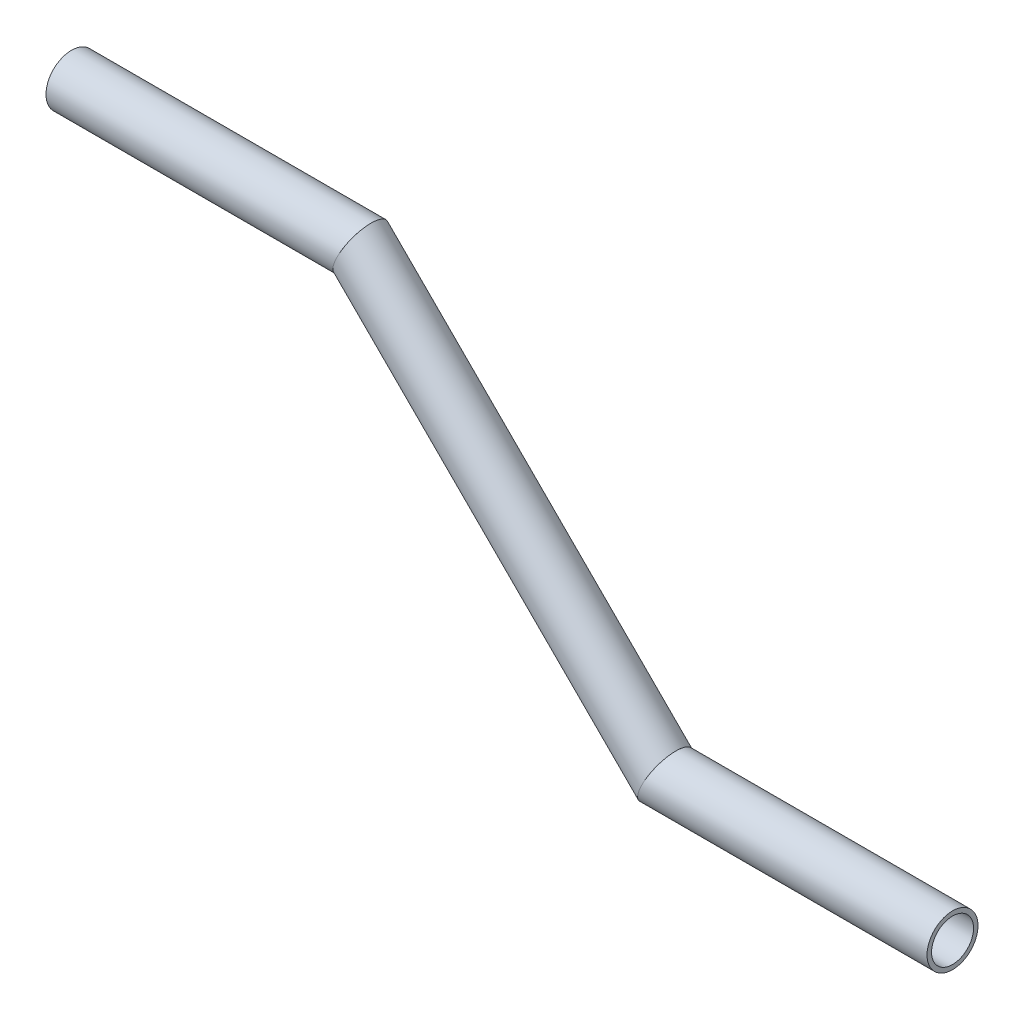
ISO-10303-21;
HEADER;
FILE_DESCRIPTION(('STEP AP214'),'2;1');
FILE_NAME('part.step','',(''),(''),'','','');
FILE_SCHEMA(('AUTOMOTIVE_DESIGN { 1 0 10303 214 1 1 1 1 }'));
ENDSEC;
DATA;
#1=APPLICATION_CONTEXT('core data for automotive mechanical design processes');
#2=APPLICATION_PROTOCOL_DEFINITION('international standard','automotive_design',2000,#1);
#3=PRODUCT_CONTEXT('',#1,'mechanical');
#4=PRODUCT('Part','Part','',(#3));
#5=PRODUCT_RELATED_PRODUCT_CATEGORY('part','',(#4));
#6=PRODUCT_DEFINITION_FORMATION('','',#4);
#7=PRODUCT_DEFINITION_CONTEXT('part definition',#1,'design');
#8=PRODUCT_DEFINITION('design','',#6,#7);
#9=PRODUCT_DEFINITION_SHAPE('','',#8);
#10=(LENGTH_UNIT() NAMED_UNIT(*) SI_UNIT(.MILLI.,.METRE.));
#11=(NAMED_UNIT(*) PLANE_ANGLE_UNIT() SI_UNIT($,.RADIAN.));
#12=(NAMED_UNIT(*) SI_UNIT($,.STERADIAN.) SOLID_ANGLE_UNIT());
#13=UNCERTAINTY_MEASURE_WITH_UNIT(LENGTH_MEASURE(1.E-05),#10,'distance_accuracy_value','');
#14=(GEOMETRIC_REPRESENTATION_CONTEXT(3) GLOBAL_UNCERTAINTY_ASSIGNED_CONTEXT((#13)) GLOBAL_UNIT_ASSIGNED_CONTEXT((#10,
#11,#12)) REPRESENTATION_CONTEXT('',''));
#15=CARTESIAN_POINT('',(0.,0.,0.));
#16=DIRECTION('',(0.,0.,1.));
#17=DIRECTION('',(1.,0.,0.));
#18=AXIS2_PLACEMENT_3D('',#15,#16,#17);
#19=CARTESIAN_POINT('',(-184.284051654666,647.334855559681,0.));
#20=DIRECTION('',(1.,0.,0.));
#21=DIRECTION('',(0.,0.,-1.));
#22=AXIS2_PLACEMENT_3D('',#19,#20,#21);
#23=CYLINDRICAL_SURFACE('',#22,2.61620000000002);
#24=CARTESIAN_POINT('',(-148.488053197196,647.334855559681,0.));
#25=DIRECTION('',(-1.,0.,0.));
#26=DIRECTION('',(0.,0.,1.));
#27=AXIS2_PLACEMENT_3D('',#24,#25,#26);
#28=CIRCLE('',#27,2.61620000000002);
#29=CARTESIAN_POINT('',(-148.488053197196,647.334855559681,2.61620000000002));
#30=VERTEX_POINT('',#29);
#31=EDGE_CURVE('E54',#30,#30,#28,.T.);
#32=ORIENTED_EDGE('',*,*,#31,.F.);
#33=EDGE_LOOP('',(#32));
#34=FACE_BOUND('',#33,.T.);
#35=CARTESIAN_POINT('',(-184.284051654666,647.334855559681,0.));
#36=DIRECTION('',(-0.923879532511287,0.38268343236509,0.));
#37=DIRECTION('',(0.38268343236509,0.923879532511287,0.));
#38=AXIS2_PLACEMENT_3D('',#35,#36,#37);
#39=ELLIPSE('',#38,2.83175447440498,2.61620000000002);
#40=CARTESIAN_POINT('',(-183.200386132786,649.951055559681,0.));
#41=VERTEX_POINT('',#40);
#42=EDGE_CURVE('E50',#41,#41,#39,.T.);
#43=ORIENTED_EDGE('',*,*,#42,.T.);
#44=EDGE_LOOP('',(#43));
#45=FACE_BOUND('',#44,.T.);
#46=ADVANCED_FACE('F46',(#34,#45),#23,.F.);
#47=CARTESIAN_POINT('',(-184.284051654666,647.334855559681,0.));
#48=DIRECTION('',(1.,0.,0.));
#49=DIRECTION('',(0.,0.,-1.));
#50=AXIS2_PLACEMENT_3D('',#47,#48,#49);
#51=CYLINDRICAL_SURFACE('',#50,3.17499999999997);
#52=CARTESIAN_POINT('',(-148.488053197196,647.334855559681,0.));
#53=DIRECTION('',(-1.,0.,0.));
#54=DIRECTION('',(0.,0.,1.));
#55=AXIS2_PLACEMENT_3D('',#52,#53,#54);
#56=CIRCLE('',#55,3.17499999999997);
#57=CARTESIAN_POINT('',(-148.488053197196,647.334855559681,3.17499999999997));
#58=VERTEX_POINT('',#57);
#59=EDGE_CURVE('E58',#58,#58,#56,.T.);
#60=ORIENTED_EDGE('',*,*,#59,.T.);
#61=EDGE_LOOP('',(#60));
#62=FACE_BOUND('',#61,.T.);
#63=CARTESIAN_POINT('',(-184.284051654666,647.334855559681,0.));
#64=DIRECTION('',(-0.923879532511287,0.38268343236509,0.));
#65=DIRECTION('',(0.38268343236509,0.923879532511287,0.));
#66=AXIS2_PLACEMENT_3D('',#63,#64,#65);
#67=ELLIPSE('',#66,3.43659523592832,3.17499999999997);
#68=CARTESIAN_POINT('',(-182.968923594131,650.509855559681,0.));
#69=VERTEX_POINT('',#68);
#70=EDGE_CURVE('E12',#69,#69,#67,.T.);
#71=ORIENTED_EDGE('',*,*,#70,.F.);
#72=EDGE_LOOP('',(#71));
#73=FACE_BOUND('',#72,.T.);
#74=ADVANCED_FACE('F73',(#62,#73),#51,.T.);
#75=CARTESIAN_POINT('',(-148.488053197196,647.334855559681,0.));
#76=DIRECTION('',(-1.,0.,0.));
#77=DIRECTION('',(0.,0.,1.));
#78=AXIS2_PLACEMENT_3D('',#75,#76,#77);
#79=PLANE('',#78);
#80=ORIENTED_EDGE('',*,*,#31,.T.);
#81=EDGE_LOOP('',(#80));
#82=FACE_BOUND('',#81,.T.);
#83=ORIENTED_EDGE('',*,*,#59,.F.);
#84=EDGE_LOOP('',(#83));
#85=FACE_BOUND('',#84,.T.);
#86=ADVANCED_FACE('F69',(#82,#85),#79,.F.);
#87=CARTESIAN_POINT('',(-184.284051654666,647.334855559681,0.));
#88=DIRECTION('',(-0.923879532511287,0.38268343236509,0.));
#89=DIRECTION('',(-0.38268343236509,-0.923879532511287,0.));
#90=AXIS2_PLACEMENT_3D('',#87,#88,#89);
#91=PLANE('',#90);
#92=ORIENTED_EDGE('',*,*,#42,.F.);
#93=EDGE_LOOP('',(#92));
#94=FACE_BOUND('',#93,.T.);
#95=ORIENTED_EDGE('',*,*,#70,.T.);
#96=EDGE_LOOP('',(#95));
#97=FACE_BOUND('',#96,.T.);
#98=ADVANCED_FACE('F48',(#94,#97),#91,.T.);
#99=CLOSED_SHELL('',(#46,#74,#86,#98));
#100=MANIFOLD_SOLID_BREP('B2',#99);
#101=CARTESIAN_POINT('',(-222.250290055713,685.301093960728,0.));
#102=DIRECTION('',(0.707106781186547,-0.707106781186548,0.));
#103=DIRECTION('',(0.707106781186548,0.707106781186547,0.));
#104=AXIS2_PLACEMENT_3D('',#101,#102,#103);
#105=CYLINDRICAL_SURFACE('',#104,2.61620000000002);
#106=CARTESIAN_POINT('',(-222.250290055713,685.301093960728,0.));
#107=DIRECTION('',(-0.923879532511287,0.38268343236509,0.));
#108=DIRECTION('',(-0.38268343236509,-0.923879532511287,0.));
#109=AXIS2_PLACEMENT_3D('',#106,#107,#108);
#110=ELLIPSE('',#109,2.83175447440498,2.61620000000002);
#111=CARTESIAN_POINT('',(-223.333955577593,682.684893960728,0.));
#112=VERTEX_POINT('',#111);
#113=EDGE_CURVE('E149',#112,#112,#110,.T.);
#114=ORIENTED_EDGE('',*,*,#113,.T.);
#115=EDGE_LOOP('',(#114));
#116=FACE_BOUND('',#115,.T.);
#117=CARTESIAN_POINT('',(-184.284051654666,647.334855559681,0.));
#118=DIRECTION('',(0.923879532511287,-0.38268343236509,0.));
#119=DIRECTION('',(-0.38268343236509,-0.923879532511287,0.));
#120=AXIS2_PLACEMENT_3D('',#117,#118,#119);
#121=ELLIPSE('',#120,2.83175447440498,2.61620000000002);
#122=CARTESIAN_POINT('',(-185.367717176547,644.718655559681,0.));
#123=VERTEX_POINT('',#122);
#124=EDGE_CURVE('E139',#123,#123,#121,.T.);
#125=ORIENTED_EDGE('',*,*,#124,.T.);
#126=EDGE_LOOP('',(#125));
#127=FACE_BOUND('',#126,.T.);
#128=ADVANCED_FACE('F135',(#116,#127),#105,.F.);
#129=CARTESIAN_POINT('',(-222.250290055713,685.301093960728,0.));
#130=DIRECTION('',(0.707106781186547,-0.707106781186548,0.));
#131=DIRECTION('',(0.707106781186548,0.707106781186547,0.));
#132=AXIS2_PLACEMENT_3D('',#129,#130,#131);
#133=CYLINDRICAL_SURFACE('',#132,3.17499999999997);
#134=CARTESIAN_POINT('',(-222.250290055713,685.301093960728,0.));
#135=DIRECTION('',(-0.923879532511287,0.38268343236509,0.));
#136=DIRECTION('',(-0.38268343236509,-0.923879532511287,0.));
#137=AXIS2_PLACEMENT_3D('',#134,#135,#136);
#138=ELLIPSE('',#137,3.43659523592832,3.17499999999997);
#139=CARTESIAN_POINT('',(-223.565418116247,682.126093960728,0.));
#140=VERTEX_POINT('',#139);
#141=EDGE_CURVE('E143',#140,#140,#138,.T.);
#142=ORIENTED_EDGE('',*,*,#141,.F.);
#143=EDGE_LOOP('',(#142));
#144=FACE_BOUND('',#143,.T.);
#145=CARTESIAN_POINT('',(-184.284051654666,647.334855559681,0.));
#146=DIRECTION('',(0.923879532511287,-0.38268343236509,0.));
#147=DIRECTION('',(-0.38268343236509,-0.923879532511287,0.));
#148=AXIS2_PLACEMENT_3D('',#145,#146,#147);
#149=ELLIPSE('',#148,3.43659523592832,3.17499999999997);
#150=CARTESIAN_POINT('',(-185.599179715201,644.159855559681,0.));
#151=VERTEX_POINT('',#150);
#152=EDGE_CURVE('E45',#151,#151,#149,.T.);
#153=ORIENTED_EDGE('',*,*,#152,.F.);
#154=EDGE_LOOP('',(#153));
#155=FACE_BOUND('',#154,.T.);
#156=ADVANCED_FACE('F162',(#144,#155),#133,.T.);
#157=CARTESIAN_POINT('',(-222.250290055713,685.301093960728,0.));
#158=DIRECTION('',(-0.923879532511287,0.38268343236509,0.));
#159=DIRECTION('',(-0.38268343236509,-0.923879532511287,0.));
#160=AXIS2_PLACEMENT_3D('',#157,#158,#159);
#161=PLANE('',#160);
#162=ORIENTED_EDGE('',*,*,#113,.F.);
#163=EDGE_LOOP('',(#162));
#164=FACE_BOUND('',#163,.T.);
#165=ORIENTED_EDGE('',*,*,#141,.T.);
#166=EDGE_LOOP('',(#165));
#167=FACE_BOUND('',#166,.T.);
#168=ADVANCED_FACE('F158',(#164,#167),#161,.T.);
#169=CARTESIAN_POINT('',(-184.284051654666,647.334855559681,0.));
#170=DIRECTION('',(0.923879532511287,-0.38268343236509,0.));
#171=DIRECTION('',(0.38268343236509,0.923879532511287,0.));
#172=AXIS2_PLACEMENT_3D('',#169,#170,#171);
#173=PLANE('',#172);
#174=ORIENTED_EDGE('',*,*,#124,.F.);
#175=EDGE_LOOP('',(#174));
#176=FACE_BOUND('',#175,.T.);
#177=ORIENTED_EDGE('',*,*,#152,.T.);
#178=EDGE_LOOP('',(#177));
#179=FACE_BOUND('',#178,.T.);
#180=ADVANCED_FACE('F137',(#176,#179),#173,.T.);
#181=CLOSED_SHELL('',(#128,#156,#168,#180));
#182=MANIFOLD_SOLID_BREP('B7',#181);
#183=CARTESIAN_POINT('',(-258.244996938405,685.301093960728,0.));
#184=DIRECTION('',(1.,0.,0.));
#185=DIRECTION('',(0.,0.,-1.));
#186=AXIS2_PLACEMENT_3D('',#183,#184,#185);
#187=CYLINDRICAL_SURFACE('',#186,2.61620000000002);
#188=CARTESIAN_POINT('',(-258.244996938405,685.301093960728,0.));
#189=DIRECTION('',(-1.,0.,0.));
#190=DIRECTION('',(0.,0.,1.));
#191=AXIS2_PLACEMENT_3D('',#188,#189,#190);
#192=CIRCLE('',#191,2.61620000000002);
#193=CARTESIAN_POINT('',(-258.244996938405,685.301093960728,2.61620000000002));
#194=VERTEX_POINT('',#193);
#195=EDGE_CURVE('E233',#194,#194,#192,.T.);
#196=ORIENTED_EDGE('',*,*,#195,.T.);
#197=EDGE_LOOP('',(#196));
#198=FACE_BOUND('',#197,.T.);
#199=CARTESIAN_POINT('',(-222.250290055713,685.301093960728,0.));
#200=DIRECTION('',(0.923879532511287,-0.38268343236509,0.));
#201=DIRECTION('',(0.38268343236509,0.923879532511287,0.));
#202=AXIS2_PLACEMENT_3D('',#199,#200,#201);
#203=ELLIPSE('',#202,2.83175447440498,2.61620000000002);
#204=CARTESIAN_POINT('',(-221.166624533832,687.917293960728,0.));
#205=VERTEX_POINT('',#204);
#206=EDGE_CURVE('E223',#205,#205,#203,.T.);
#207=ORIENTED_EDGE('',*,*,#206,.T.);
#208=EDGE_LOOP('',(#207));
#209=FACE_BOUND('',#208,.T.);
#210=ADVANCED_FACE('F219',(#198,#209),#187,.F.);
#211=CARTESIAN_POINT('',(-258.244996938405,685.301093960728,0.));
#212=DIRECTION('',(1.,0.,0.));
#213=DIRECTION('',(0.,0.,-1.));
#214=AXIS2_PLACEMENT_3D('',#211,#212,#213);
#215=CYLINDRICAL_SURFACE('',#214,3.17499999999997);
#216=CARTESIAN_POINT('',(-258.244996938405,685.301093960728,0.));
#217=DIRECTION('',(-1.,0.,0.));
#218=DIRECTION('',(0.,0.,1.));
#219=AXIS2_PLACEMENT_3D('',#216,#217,#218);
#220=CIRCLE('',#219,3.17499999999997);
#221=CARTESIAN_POINT('',(-258.244996938405,685.301093960728,3.17499999999997));
#222=VERTEX_POINT('',#221);
#223=EDGE_CURVE('E227',#222,#222,#220,.T.);
#224=ORIENTED_EDGE('',*,*,#223,.F.);
#225=EDGE_LOOP('',(#224));
#226=FACE_BOUND('',#225,.T.);
#227=CARTESIAN_POINT('',(-222.250290055713,685.301093960728,0.));
#228=DIRECTION('',(0.923879532511287,-0.38268343236509,0.));
#229=DIRECTION('',(0.38268343236509,0.923879532511287,0.));
#230=AXIS2_PLACEMENT_3D('',#227,#228,#229);
#231=ELLIPSE('',#230,3.43659523592832,3.17499999999997);
#232=CARTESIAN_POINT('',(-220.935161995178,688.476093960728,0.));
#233=VERTEX_POINT('',#232);
#234=EDGE_CURVE('E134',#233,#233,#231,.T.);
#235=ORIENTED_EDGE('',*,*,#234,.F.);
#236=EDGE_LOOP('',(#235));
#237=FACE_BOUND('',#236,.T.);
#238=ADVANCED_FACE('F246',(#226,#237),#215,.T.);
#239=CARTESIAN_POINT('',(-258.244996938405,685.301093960728,0.));
#240=DIRECTION('',(-1.,0.,0.));
#241=DIRECTION('',(0.,0.,1.));
#242=AXIS2_PLACEMENT_3D('',#239,#240,#241);
#243=PLANE('',#242);
#244=ORIENTED_EDGE('',*,*,#195,.F.);
#245=EDGE_LOOP('',(#244));
#246=FACE_BOUND('',#245,.T.);
#247=ORIENTED_EDGE('',*,*,#223,.T.);
#248=EDGE_LOOP('',(#247));
#249=FACE_BOUND('',#248,.T.);
#250=ADVANCED_FACE('F242',(#246,#249),#243,.T.);
#251=CARTESIAN_POINT('',(-222.250290055713,685.301093960728,0.));
#252=DIRECTION('',(0.923879532511287,-0.38268343236509,0.));
#253=DIRECTION('',(0.38268343236509,0.923879532511287,0.));
#254=AXIS2_PLACEMENT_3D('',#251,#252,#253);
#255=PLANE('',#254);
#256=ORIENTED_EDGE('',*,*,#206,.F.);
#257=EDGE_LOOP('',(#256));
#258=FACE_BOUND('',#257,.T.);
#259=ORIENTED_EDGE('',*,*,#234,.T.);
#260=EDGE_LOOP('',(#259));
#261=FACE_BOUND('',#260,.T.);
#262=ADVANCED_FACE('F221',(#258,#261),#255,.T.);
#263=CLOSED_SHELL('',(#210,#238,#250,#262));
#264=MANIFOLD_SOLID_BREP('B40',#263);
#265=ADVANCED_BREP_SHAPE_REPRESENTATION('',(#18,#100,#182,#264),#14);
#266=SHAPE_DEFINITION_REPRESENTATION(#9,#265);
ENDSEC;
END-ISO-10303-21;
